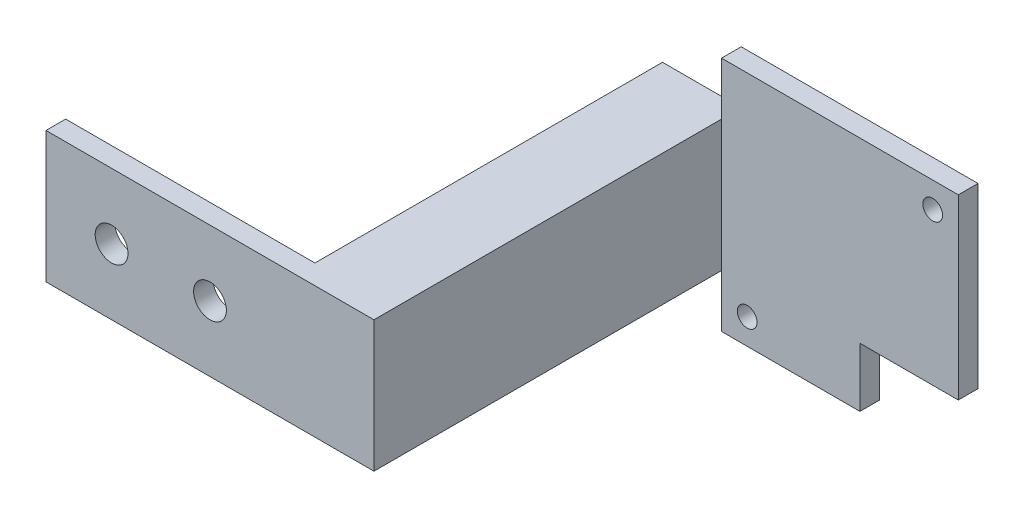
ISO-10303-21;
HEADER;
FILE_DESCRIPTION(('STEP AP214'),'2;1');
FILE_NAME('part.step','',(''),(''),'','','');
FILE_SCHEMA(('AUTOMOTIVE_DESIGN { 1 0 10303 214 1 1 1 1 }'));
ENDSEC;
DATA;
#1=APPLICATION_CONTEXT('core data for automotive mechanical design processes');
#2=APPLICATION_PROTOCOL_DEFINITION('international standard','automotive_design',2000,#1);
#3=PRODUCT_CONTEXT('',#1,'mechanical');
#4=PRODUCT('Part','Part','',(#3));
#5=PRODUCT_RELATED_PRODUCT_CATEGORY('part','',(#4));
#6=PRODUCT_DEFINITION_FORMATION('','',#4);
#7=PRODUCT_DEFINITION_CONTEXT('part definition',#1,'design');
#8=PRODUCT_DEFINITION('design','',#6,#7);
#9=PRODUCT_DEFINITION_SHAPE('','',#8);
#10=(LENGTH_UNIT() NAMED_UNIT(*) SI_UNIT(.MILLI.,.METRE.));
#11=(NAMED_UNIT(*) PLANE_ANGLE_UNIT() SI_UNIT($,.RADIAN.));
#12=(NAMED_UNIT(*) SI_UNIT($,.STERADIAN.) SOLID_ANGLE_UNIT());
#13=UNCERTAINTY_MEASURE_WITH_UNIT(LENGTH_MEASURE(1.E-05),#10,'distance_accuracy_value','');
#14=(GEOMETRIC_REPRESENTATION_CONTEXT(3) GLOBAL_UNCERTAINTY_ASSIGNED_CONTEXT((#13)) GLOBAL_UNIT_ASSIGNED_CONTEXT((#10,
#11,#12)) REPRESENTATION_CONTEXT('',''));
#15=CARTESIAN_POINT('',(0.,0.,0.));
#16=DIRECTION('',(0.,0.,1.));
#17=DIRECTION('',(1.,0.,0.));
#18=AXIS2_PLACEMENT_3D('',#15,#16,#17);
#19=CARTESIAN_POINT('',(-18.05,-18.05,3.));
#20=DIRECTION('',(1.,0.,0.));
#21=DIRECTION('',(0.,0.,-1.));
#22=AXIS2_PLACEMENT_3D('',#19,#20,#21);
#23=PLANE('',#22);
#24=DIRECTION('',(0.,0.,1.));
#25=VECTOR('',#24,1.);
#26=CARTESIAN_POINT('',(-18.05,-10.,0.));
#27=LINE('',#26,#25);
#28=CARTESIAN_POINT('',(-18.05,-10.,0.));
#29=VERTEX_POINT('',#28);
#30=CARTESIAN_POINT('',(-18.05,-10.,3.));
#31=VERTEX_POINT('',#30);
#32=EDGE_CURVE('E221',#29,#31,#27,.T.);
#33=ORIENTED_EDGE('',*,*,#32,.F.);
#34=DIRECTION('',(0.,-1.,0.));
#35=VECTOR('',#34,1.);
#36=CARTESIAN_POINT('',(-18.05,-18.05,0.));
#37=LINE('',#36,#35);
#38=CARTESIAN_POINT('',(-18.05,-18.05,0.));
#39=VERTEX_POINT('',#38);
#40=EDGE_CURVE('E262',#29,#39,#37,.T.);
#41=ORIENTED_EDGE('',*,*,#40,.T.);
#42=DIRECTION('',(0.,0.,-1.));
#43=VECTOR('',#42,1.);
#44=CARTESIAN_POINT('',(-18.05,-18.05,3.));
#45=LINE('',#44,#43);
#46=CARTESIAN_POINT('',(-18.05,-18.05,3.));
#47=VERTEX_POINT('',#46);
#48=EDGE_CURVE('E11',#47,#39,#45,.T.);
#49=ORIENTED_EDGE('',*,*,#48,.F.);
#50=DIRECTION('',(0.,-1.,0.));
#51=VECTOR('',#50,1.);
#52=CARTESIAN_POINT('',(-18.05,-18.05,3.));
#53=LINE('',#52,#51);
#54=EDGE_CURVE('E92',#31,#47,#53,.T.);
#55=ORIENTED_EDGE('',*,*,#54,.F.);
#56=EDGE_LOOP('',(#33,#41,#49,#55));
#57=FACE_BOUND('',#56,.T.);
#58=ADVANCED_FACE('F44',(#57),#23,.F.);
#59=CARTESIAN_POINT('',(-18.05,18.05,0.));
#60=VERTEX_POINT('',#59);
#61=CARTESIAN_POINT('',(-18.05,10.,0.));
#62=VERTEX_POINT('',#61);
#63=EDGE_CURVE('E286',#60,#62,#37,.T.);
#64=ORIENTED_EDGE('',*,*,#63,.T.);
#65=DIRECTION('',(0.,0.,1.));
#66=VECTOR('',#65,1.);
#67=CARTESIAN_POINT('',(-18.05,10.,0.));
#68=LINE('',#67,#66);
#69=CARTESIAN_POINT('',(-18.05,10.,3.));
#70=VERTEX_POINT('',#69);
#71=EDGE_CURVE('E220',#62,#70,#68,.T.);
#72=ORIENTED_EDGE('',*,*,#71,.T.);
#73=CARTESIAN_POINT('',(-18.05,18.05,3.));
#74=VERTEX_POINT('',#73);
#75=EDGE_CURVE('E274',#74,#70,#53,.T.);
#76=ORIENTED_EDGE('',*,*,#75,.F.);
#77=DIRECTION('',(0.,0.,-1.));
#78=VECTOR('',#77,1.);
#79=CARTESIAN_POINT('',(-18.05,18.05,3.));
#80=LINE('',#79,#78);
#81=EDGE_CURVE('E285',#74,#60,#80,.T.);
#82=ORIENTED_EDGE('',*,*,#81,.T.);
#83=EDGE_LOOP('',(#64,#72,#76,#82));
#84=FACE_BOUND('',#83,.T.);
#85=ADVANCED_FACE('F46',(#84),#23,.F.);
#86=CARTESIAN_POINT('',(18.05,-18.05,3.));
#87=DIRECTION('',(0.,1.,0.));
#88=DIRECTION('',(-1.,0.,0.));
#89=AXIS2_PLACEMENT_3D('',#86,#87,#88);
#90=PLANE('',#89);
#91=DIRECTION('',(1.,0.,0.));
#92=VECTOR('',#91,1.);
#93=CARTESIAN_POINT('',(18.05,-18.05,0.));
#94=LINE('',#93,#92);
#95=CARTESIAN_POINT('',(3.05,-18.05,0.));
#96=VERTEX_POINT('',#95);
#97=EDGE_CURVE('E290',#39,#96,#94,.T.);
#98=ORIENTED_EDGE('',*,*,#97,.T.);
#99=DIRECTION('',(0.,0.,1.));
#100=VECTOR('',#99,1.);
#101=CARTESIAN_POINT('',(3.05,-18.05,0.));
#102=LINE('',#101,#100);
#103=CARTESIAN_POINT('',(3.05,-18.05,3.));
#104=VERTEX_POINT('',#103);
#105=EDGE_CURVE('E248',#96,#104,#102,.T.);
#106=ORIENTED_EDGE('',*,*,#105,.T.);
#107=DIRECTION('',(1.,0.,0.));
#108=VECTOR('',#107,1.);
#109=CARTESIAN_POINT('',(18.05,-18.05,3.));
#110=LINE('',#109,#108);
#111=EDGE_CURVE('E277',#47,#104,#110,.T.);
#112=ORIENTED_EDGE('',*,*,#111,.F.);
#113=ORIENTED_EDGE('',*,*,#48,.T.);
#114=EDGE_LOOP('',(#98,#106,#112,#113));
#115=FACE_BOUND('',#114,.T.);
#116=ADVANCED_FACE('F325',(#115),#90,.F.);
#117=CARTESIAN_POINT('',(18.05,-18.05,3.));
#118=DIRECTION('',(-1.,0.,0.));
#119=DIRECTION('',(0.,0.,1.));
#120=AXIS2_PLACEMENT_3D('',#117,#118,#119);
#121=PLANE('',#120);
#122=DIRECTION('',(0.,1.,0.));
#123=VECTOR('',#122,1.);
#124=CARTESIAN_POINT('',(18.05,-18.05,3.));
#125=LINE('',#124,#123);
#126=CARTESIAN_POINT('',(18.05,-9.05,3.));
#127=VERTEX_POINT('',#126);
#128=CARTESIAN_POINT('',(18.05,18.05,3.));
#129=VERTEX_POINT('',#128);
#130=EDGE_CURVE('E280',#127,#129,#125,.T.);
#131=ORIENTED_EDGE('',*,*,#130,.F.);
#132=DIRECTION('',(0.,0.,1.));
#133=VECTOR('',#132,1.);
#134=CARTESIAN_POINT('',(18.05,-9.05,0.));
#135=LINE('',#134,#133);
#136=CARTESIAN_POINT('',(18.05,-9.05,0.));
#137=VERTEX_POINT('',#136);
#138=EDGE_CURVE('E242',#137,#127,#135,.T.);
#139=ORIENTED_EDGE('',*,*,#138,.F.);
#140=DIRECTION('',(0.,1.,0.));
#141=VECTOR('',#140,1.);
#142=CARTESIAN_POINT('',(18.05,-18.05,0.));
#143=LINE('',#142,#141);
#144=CARTESIAN_POINT('',(18.05,18.05,0.));
#145=VERTEX_POINT('',#144);
#146=EDGE_CURVE('E294',#137,#145,#143,.T.);
#147=ORIENTED_EDGE('',*,*,#146,.T.);
#148=DIRECTION('',(0.,0.,-1.));
#149=VECTOR('',#148,1.);
#150=CARTESIAN_POINT('',(18.05,18.05,3.));
#151=LINE('',#150,#149);
#152=EDGE_CURVE('E53',#129,#145,#151,.T.);
#153=ORIENTED_EDGE('',*,*,#152,.F.);
#154=EDGE_LOOP('',(#131,#139,#147,#153));
#155=FACE_BOUND('',#154,.T.);
#156=ADVANCED_FACE('F332',(#155),#121,.F.);
#157=CARTESIAN_POINT('',(18.05,18.05,3.));
#158=DIRECTION('',(0.,-1.,0.));
#159=DIRECTION('',(1.,0.,0.));
#160=AXIS2_PLACEMENT_3D('',#157,#158,#159);
#161=PLANE('',#160);
#162=DIRECTION('',(-1.,0.,0.));
#163=VECTOR('',#162,1.);
#164=CARTESIAN_POINT('',(18.05,18.05,0.));
#165=LINE('',#164,#163);
#166=EDGE_CURVE('E86',#145,#60,#165,.T.);
#167=ORIENTED_EDGE('',*,*,#166,.T.);
#168=ORIENTED_EDGE('',*,*,#81,.F.);
#169=DIRECTION('',(-1.,0.,0.));
#170=VECTOR('',#169,1.);
#171=CARTESIAN_POINT('',(18.05,18.05,3.));
#172=LINE('',#171,#170);
#173=EDGE_CURVE('E69',#129,#74,#172,.T.);
#174=ORIENTED_EDGE('',*,*,#173,.F.);
#175=ORIENTED_EDGE('',*,*,#152,.T.);
#176=EDGE_LOOP('',(#167,#168,#174,#175));
#177=FACE_BOUND('',#176,.T.);
#178=ADVANCED_FACE('F302',(#177),#161,.F.);
#179=CARTESIAN_POINT('',(0.,0.,3.));
#180=DIRECTION('',(0.,0.,1.));
#181=DIRECTION('',(1.,0.,0.));
#182=AXIS2_PLACEMENT_3D('',#179,#180,#181);
#183=PLANE('',#182);
#184=DIRECTION('',(0.,1.,0.));
#185=VECTOR('',#184,1.);
#186=CARTESIAN_POINT('',(-18.05,-10.,3.));
#187=LINE('',#186,#185);
#188=EDGE_CURVE('E156',#31,#70,#187,.T.);
#189=ORIENTED_EDGE('',*,*,#188,.F.);
#190=ORIENTED_EDGE('',*,*,#54,.T.);
#191=ORIENTED_EDGE('',*,*,#111,.T.);
#192=DIRECTION('',(0.,-1.,0.));
#193=VECTOR('',#192,1.);
#194=CARTESIAN_POINT('',(3.05,-18.05,3.));
#195=LINE('',#194,#193);
#196=CARTESIAN_POINT('',(3.05,-9.05,3.));
#197=VERTEX_POINT('',#196);
#198=EDGE_CURVE('E239',#197,#104,#195,.T.);
#199=ORIENTED_EDGE('',*,*,#198,.F.);
#200=DIRECTION('',(-1.,0.,0.));
#201=VECTOR('',#200,1.);
#202=CARTESIAN_POINT('',(18.05,-9.05,3.));
#203=LINE('',#202,#201);
#204=EDGE_CURVE('E225',#127,#197,#203,.T.);
#205=ORIENTED_EDGE('',*,*,#204,.F.);
#206=ORIENTED_EDGE('',*,*,#130,.T.);
#207=ORIENTED_EDGE('',*,*,#173,.T.);
#208=ORIENTED_EDGE('',*,*,#75,.T.);
#209=EDGE_LOOP('',(#189,#190,#191,#199,#205,#206,#207,#208));
#210=FACE_BOUND('',#209,.T.);
#211=CARTESIAN_POINT('',(14.1421356237309,14.1421356237309,3.));
#212=DIRECTION('',(0.,0.,1.));
#213=DIRECTION('',(1.,0.,0.));
#214=AXIS2_PLACEMENT_3D('',#211,#212,#213);
#215=CIRCLE('',#214,1.5);
#216=CARTESIAN_POINT('',(15.642135623731,14.1421356237309,3.));
#217=VERTEX_POINT('',#216);
#218=EDGE_CURVE('E263',#217,#217,#215,.T.);
#219=ORIENTED_EDGE('',*,*,#218,.F.);
#220=EDGE_LOOP('',(#219));
#221=FACE_BOUND('',#220,.T.);
#222=CARTESIAN_POINT('',(-14.1421356237309,-14.142135623731,3.));
#223=DIRECTION('',(0.,0.,1.));
#224=DIRECTION('',(-1.,0.,0.));
#225=AXIS2_PLACEMENT_3D('',#222,#223,#224);
#226=CIRCLE('',#225,1.5);
#227=CARTESIAN_POINT('',(-15.6421356237309,-14.142135623731,3.));
#228=VERTEX_POINT('',#227);
#229=EDGE_CURVE('E267',#228,#228,#226,.T.);
#230=ORIENTED_EDGE('',*,*,#229,.F.);
#231=EDGE_LOOP('',(#230));
#232=FACE_BOUND('',#231,.T.);
#233=ADVANCED_FACE('F312',(#210,#221,#232),#183,.T.);
#234=CARTESIAN_POINT('',(0.,0.,0.));
#235=DIRECTION('',(0.,0.,1.));
#236=DIRECTION('',(1.,0.,0.));
#237=AXIS2_PLACEMENT_3D('',#234,#235,#236);
#238=PLANE('',#237);
#239=CARTESIAN_POINT('',(14.1421356237309,14.1421356237309,0.));
#240=DIRECTION('',(0.,0.,1.));
#241=DIRECTION('',(1.,0.,0.));
#242=AXIS2_PLACEMENT_3D('',#239,#240,#241);
#243=CIRCLE('',#242,1.5);
#244=CARTESIAN_POINT('',(15.642135623731,14.1421356237309,0.));
#245=VERTEX_POINT('',#244);
#246=EDGE_CURVE('E258',#245,#245,#243,.T.);
#247=ORIENTED_EDGE('',*,*,#246,.T.);
#248=EDGE_LOOP('',(#247));
#249=FACE_BOUND('',#248,.T.);
#250=CARTESIAN_POINT('',(-14.1421356237309,-14.142135623731,0.));
#251=DIRECTION('',(0.,0.,1.));
#252=DIRECTION('',(-1.,0.,0.));
#253=AXIS2_PLACEMENT_3D('',#250,#251,#252);
#254=CIRCLE('',#253,1.5);
#255=CARTESIAN_POINT('',(-15.6421356237309,-14.142135623731,0.));
#256=VERTEX_POINT('',#255);
#257=EDGE_CURVE('E252',#256,#256,#254,.T.);
#258=ORIENTED_EDGE('',*,*,#257,.T.);
#259=EDGE_LOOP('',(#258));
#260=FACE_BOUND('',#259,.T.);
#261=DIRECTION('',(-1.,0.,0.));
#262=VECTOR('',#261,1.);
#263=CARTESIAN_POINT('',(18.05,-9.05,0.));
#264=LINE('',#263,#262);
#265=CARTESIAN_POINT('',(3.05,-9.05,0.));
#266=VERTEX_POINT('',#265);
#267=EDGE_CURVE('E235',#137,#266,#264,.T.);
#268=ORIENTED_EDGE('',*,*,#267,.T.);
#269=DIRECTION('',(0.,-1.,0.));
#270=VECTOR('',#269,1.);
#271=CARTESIAN_POINT('',(3.05,-18.05,0.));
#272=LINE('',#271,#270);
#273=EDGE_CURVE('E60',#266,#96,#272,.T.);
#274=ORIENTED_EDGE('',*,*,#273,.T.);
#275=ORIENTED_EDGE('',*,*,#97,.F.);
#276=ORIENTED_EDGE('',*,*,#40,.F.);
#277=DIRECTION('',(-1.,0.,0.));
#278=VECTOR('',#277,1.);
#279=CARTESIAN_POINT('',(0.,-10.,0.));
#280=LINE('',#279,#278);
#281=CARTESIAN_POINT('',(-30.05,-10.,0.));
#282=VERTEX_POINT('',#281);
#283=EDGE_CURVE('E217',#29,#282,#280,.T.);
#284=ORIENTED_EDGE('',*,*,#283,.T.);
#285=DIRECTION('',(0.,1.,0.));
#286=VECTOR('',#285,1.);
#287=CARTESIAN_POINT('',(-30.05,0.,0.));
#288=LINE('',#287,#286);
#289=CARTESIAN_POINT('',(-30.05,10.,0.));
#290=VERTEX_POINT('',#289);
#291=EDGE_CURVE('E214',#282,#290,#288,.T.);
#292=ORIENTED_EDGE('',*,*,#291,.T.);
#293=DIRECTION('',(-1.,0.,0.));
#294=VECTOR('',#293,1.);
#295=CARTESIAN_POINT('',(0.,10.,0.));
#296=LINE('',#295,#294);
#297=EDGE_CURVE('E159',#62,#290,#296,.T.);
#298=ORIENTED_EDGE('',*,*,#297,.F.);
#299=ORIENTED_EDGE('',*,*,#63,.F.);
#300=ORIENTED_EDGE('',*,*,#166,.F.);
#301=ORIENTED_EDGE('',*,*,#146,.F.);
#302=EDGE_LOOP('',(#268,#274,#275,#276,#284,#292,#298,#299,#300,#301));
#303=FACE_BOUND('',#302,.T.);
#304=ADVANCED_FACE('F308',(#249,#260,#303),#238,.F.);
#305=CARTESIAN_POINT('',(-14.1421356237309,-14.142135623731,0.));
#306=DIRECTION('',(0.,0.,1.));
#307=DIRECTION('',(1.,0.,0.));
#308=AXIS2_PLACEMENT_3D('',#305,#306,#307);
#309=CYLINDRICAL_SURFACE('',#308,1.5);
#310=ORIENTED_EDGE('',*,*,#257,.F.);
#311=EDGE_LOOP('',(#310));
#312=FACE_BOUND('',#311,.T.);
#313=ORIENTED_EDGE('',*,*,#229,.T.);
#314=EDGE_LOOP('',(#313));
#315=FACE_BOUND('',#314,.T.);
#316=ADVANCED_FACE('F518',(#312,#315),#309,.F.);
#317=CARTESIAN_POINT('',(14.1421356237309,14.1421356237309,0.));
#318=DIRECTION('',(0.,0.,1.));
#319=DIRECTION('',(1.,0.,0.));
#320=AXIS2_PLACEMENT_3D('',#317,#318,#319);
#321=CYLINDRICAL_SURFACE('',#320,1.5);
#322=ORIENTED_EDGE('',*,*,#246,.F.);
#323=EDGE_LOOP('',(#322));
#324=FACE_BOUND('',#323,.T.);
#325=ORIENTED_EDGE('',*,*,#218,.T.);
#326=EDGE_LOOP('',(#325));
#327=FACE_BOUND('',#326,.T.);
#328=ADVANCED_FACE('F359',(#324,#327),#321,.F.);
#329=CARTESIAN_POINT('',(3.05,-18.05,0.));
#330=DIRECTION('',(-1.,0.,0.));
#331=DIRECTION('',(0.,0.,1.));
#332=AXIS2_PLACEMENT_3D('',#329,#330,#331);
#333=PLANE('',#332);
#334=ORIENTED_EDGE('',*,*,#198,.T.);
#335=ORIENTED_EDGE('',*,*,#105,.F.);
#336=ORIENTED_EDGE('',*,*,#273,.F.);
#337=DIRECTION('',(0.,0.,1.));
#338=VECTOR('',#337,1.);
#339=CARTESIAN_POINT('',(3.05,-9.05,0.));
#340=LINE('',#339,#338);
#341=EDGE_CURVE('E253',#266,#197,#340,.T.);
#342=ORIENTED_EDGE('',*,*,#341,.T.);
#343=EDGE_LOOP('',(#334,#335,#336,#342));
#344=FACE_BOUND('',#343,.T.);
#345=ADVANCED_FACE('F328',(#344),#333,.F.);
#346=CARTESIAN_POINT('',(18.05,-9.05,0.));
#347=DIRECTION('',(0.,1.,0.));
#348=DIRECTION('',(-1.,0.,0.));
#349=AXIS2_PLACEMENT_3D('',#346,#347,#348);
#350=PLANE('',#349);
#351=ORIENTED_EDGE('',*,*,#204,.T.);
#352=ORIENTED_EDGE('',*,*,#341,.F.);
#353=ORIENTED_EDGE('',*,*,#267,.F.);
#354=ORIENTED_EDGE('',*,*,#138,.T.);
#355=EDGE_LOOP('',(#351,#352,#353,#354));
#356=FACE_BOUND('',#355,.T.);
#357=ADVANCED_FACE('F330',(#356),#350,.F.);
#358=CARTESIAN_POINT('',(0.,-10.,0.));
#359=DIRECTION('',(0.,1.,0.));
#360=DIRECTION('',(-1.,0.,0.));
#361=AXIS2_PLACEMENT_3D('',#358,#359,#360);
#362=PLANE('',#361);
#363=ORIENTED_EDGE('',*,*,#32,.T.);
#364=DIRECTION('',(0.,0.,-1.));
#365=VECTOR('',#364,1.);
#366=CARTESIAN_POINT('',(-18.05,-10.,53.));
#367=LINE('',#366,#365);
#368=CARTESIAN_POINT('',(-18.05,-10.,56.));
#369=VERTEX_POINT('',#368);
#370=EDGE_CURVE('E160',#369,#31,#367,.T.);
#371=ORIENTED_EDGE('',*,*,#370,.F.);
#372=DIRECTION('',(1.,0.,0.));
#373=VECTOR('',#372,1.);
#374=CARTESIAN_POINT('',(-18.05,-10.,56.));
#375=LINE('',#374,#373);
#376=CARTESIAN_POINT('',(-68.05,-10.,56.));
#377=VERTEX_POINT('',#376);
#378=EDGE_CURVE('E175',#377,#369,#375,.T.);
#379=ORIENTED_EDGE('',*,*,#378,.F.);
#380=DIRECTION('',(0.,0.,-1.));
#381=VECTOR('',#380,1.);
#382=CARTESIAN_POINT('',(-68.05,-10.,56.));
#383=LINE('',#382,#381);
#384=CARTESIAN_POINT('',(-68.05,-10.,53.));
#385=VERTEX_POINT('',#384);
#386=EDGE_CURVE('E191',#377,#385,#383,.T.);
#387=ORIENTED_EDGE('',*,*,#386,.T.);
#388=DIRECTION('',(1.,0.,0.));
#389=VECTOR('',#388,1.);
#390=CARTESIAN_POINT('',(-18.05,-10.,53.));
#391=LINE('',#390,#389);
#392=CARTESIAN_POINT('',(-30.05,-10.,53.));
#393=VERTEX_POINT('',#392);
#394=EDGE_CURVE('E177',#385,#393,#391,.T.);
#395=ORIENTED_EDGE('',*,*,#394,.T.);
#396=DIRECTION('',(0.,0.,1.));
#397=VECTOR('',#396,1.);
#398=CARTESIAN_POINT('',(-30.05,-10.,0.));
#399=LINE('',#398,#397);
#400=EDGE_CURVE('E226',#282,#393,#399,.T.);
#401=ORIENTED_EDGE('',*,*,#400,.F.);
#402=ORIENTED_EDGE('',*,*,#283,.F.);
#403=EDGE_LOOP('',(#363,#371,#379,#387,#395,#401,#402));
#404=FACE_BOUND('',#403,.T.);
#405=ADVANCED_FACE('F316',(#404),#362,.F.);
#406=CARTESIAN_POINT('',(-30.05,0.,0.));
#407=DIRECTION('',(1.,0.,0.));
#408=DIRECTION('',(0.,0.,-1.));
#409=AXIS2_PLACEMENT_3D('',#406,#407,#408);
#410=PLANE('',#409);
#411=ORIENTED_EDGE('',*,*,#400,.T.);
#412=DIRECTION('',(0.,-1.,0.));
#413=VECTOR('',#412,1.);
#414=CARTESIAN_POINT('',(-30.05,-10.,53.));
#415=LINE('',#414,#413);
#416=CARTESIAN_POINT('',(-30.05,10.,53.));
#417=VERTEX_POINT('',#416);
#418=EDGE_CURVE('E203',#417,#393,#415,.T.);
#419=ORIENTED_EDGE('',*,*,#418,.F.);
#420=DIRECTION('',(0.,0.,1.));
#421=VECTOR('',#420,1.);
#422=CARTESIAN_POINT('',(-30.05,10.,0.));
#423=LINE('',#422,#421);
#424=EDGE_CURVE('E229',#290,#417,#423,.T.);
#425=ORIENTED_EDGE('',*,*,#424,.F.);
#426=ORIENTED_EDGE('',*,*,#291,.F.);
#427=EDGE_LOOP('',(#411,#419,#425,#426));
#428=FACE_BOUND('',#427,.T.);
#429=ADVANCED_FACE('F391',(#428),#410,.F.);
#430=CARTESIAN_POINT('',(0.,10.,0.));
#431=DIRECTION('',(0.,1.,0.));
#432=DIRECTION('',(-1.,0.,0.));
#433=AXIS2_PLACEMENT_3D('',#430,#431,#432);
#434=PLANE('',#433);
#435=ORIENTED_EDGE('',*,*,#424,.T.);
#436=DIRECTION('',(-1.,0.,0.));
#437=VECTOR('',#436,1.);
#438=CARTESIAN_POINT('',(-18.05,10.,53.));
#439=LINE('',#438,#437);
#440=CARTESIAN_POINT('',(-68.05,10.,53.));
#441=VERTEX_POINT('',#440);
#442=EDGE_CURVE('E192',#417,#441,#439,.T.);
#443=ORIENTED_EDGE('',*,*,#442,.T.);
#444=DIRECTION('',(0.,0.,-1.));
#445=VECTOR('',#444,1.);
#446=CARTESIAN_POINT('',(-68.05,10.,56.));
#447=LINE('',#446,#445);
#448=CARTESIAN_POINT('',(-68.05,10.,56.));
#449=VERTEX_POINT('',#448);
#450=EDGE_CURVE('E166',#449,#441,#447,.T.);
#451=ORIENTED_EDGE('',*,*,#450,.F.);
#452=DIRECTION('',(-1.,0.,0.));
#453=VECTOR('',#452,1.);
#454=CARTESIAN_POINT('',(-18.05,10.,56.));
#455=LINE('',#454,#453);
#456=CARTESIAN_POINT('',(-18.05,10.,56.));
#457=VERTEX_POINT('',#456);
#458=EDGE_CURVE('E163',#457,#449,#455,.T.);
#459=ORIENTED_EDGE('',*,*,#458,.F.);
#460=DIRECTION('',(0.,0.,-1.));
#461=VECTOR('',#460,1.);
#462=CARTESIAN_POINT('',(-18.05,10.,53.));
#463=LINE('',#462,#461);
#464=EDGE_CURVE('E150',#457,#70,#463,.T.);
#465=ORIENTED_EDGE('',*,*,#464,.T.);
#466=ORIENTED_EDGE('',*,*,#71,.F.);
#467=ORIENTED_EDGE('',*,*,#297,.T.);
#468=EDGE_LOOP('',(#435,#443,#451,#459,#465,#466,#467));
#469=FACE_BOUND('',#468,.T.);
#470=ADVANCED_FACE('F164',(#469),#434,.T.);
#471=CARTESIAN_POINT('',(-18.05,-10.,53.));
#472=DIRECTION('',(-1.,0.,0.));
#473=DIRECTION('',(0.,0.,1.));
#474=AXIS2_PLACEMENT_3D('',#471,#472,#473);
#475=PLANE('',#474);
#476=ORIENTED_EDGE('',*,*,#188,.T.);
#477=ORIENTED_EDGE('',*,*,#464,.F.);
#478=DIRECTION('',(0.,1.,0.));
#479=VECTOR('',#478,1.);
#480=CARTESIAN_POINT('',(-18.05,-10.,56.));
#481=LINE('',#480,#479);
#482=EDGE_CURVE('E155',#369,#457,#481,.T.);
#483=ORIENTED_EDGE('',*,*,#482,.F.);
#484=ORIENTED_EDGE('',*,*,#370,.T.);
#485=EDGE_LOOP('',(#476,#477,#483,#484));
#486=FACE_BOUND('',#485,.T.);
#487=ADVANCED_FACE('F152',(#486),#475,.F.);
#488=CARTESIAN_POINT('',(0.,0.,53.));
#489=DIRECTION('',(0.,0.,1.));
#490=DIRECTION('',(1.,0.,0.));
#491=AXIS2_PLACEMENT_3D('',#488,#489,#490);
#492=PLANE('',#491);
#493=CARTESIAN_POINT('',(-58.05,0.,53.));
#494=DIRECTION('',(0.,0.,1.));
#495=DIRECTION('',(1.,0.,0.));
#496=AXIS2_PLACEMENT_3D('',#493,#494,#495);
#497=CIRCLE('',#496,2.5);
#498=CARTESIAN_POINT('',(-55.55,0.,53.));
#499=VERTEX_POINT('',#498);
#500=EDGE_CURVE('E195',#499,#499,#497,.T.);
#501=ORIENTED_EDGE('',*,*,#500,.T.);
#502=EDGE_LOOP('',(#501));
#503=FACE_BOUND('',#502,.T.);
#504=CARTESIAN_POINT('',(-43.05,0.,53.));
#505=DIRECTION('',(0.,0.,1.));
#506=DIRECTION('',(1.,0.,0.));
#507=AXIS2_PLACEMENT_3D('',#504,#505,#506);
#508=CIRCLE('',#507,2.5);
#509=CARTESIAN_POINT('',(-40.55,0.,53.));
#510=VERTEX_POINT('',#509);
#511=EDGE_CURVE('E184',#510,#510,#508,.T.);
#512=ORIENTED_EDGE('',*,*,#511,.T.);
#513=EDGE_LOOP('',(#512));
#514=FACE_BOUND('',#513,.T.);
#515=ORIENTED_EDGE('',*,*,#442,.F.);
#516=ORIENTED_EDGE('',*,*,#418,.T.);
#517=ORIENTED_EDGE('',*,*,#394,.F.);
#518=DIRECTION('',(0.,-1.,0.));
#519=VECTOR('',#518,1.);
#520=CARTESIAN_POINT('',(-68.05,-10.,53.));
#521=LINE('',#520,#519);
#522=EDGE_CURVE('E181',#441,#385,#521,.T.);
#523=ORIENTED_EDGE('',*,*,#522,.F.);
#524=EDGE_LOOP('',(#515,#516,#517,#523));
#525=FACE_BOUND('',#524,.T.);
#526=ADVANCED_FACE('F412',(#503,#514,#525),#492,.F.);
#527=CARTESIAN_POINT('',(-68.05,-10.,56.));
#528=DIRECTION('',(1.,0.,0.));
#529=DIRECTION('',(0.,0.,-1.));
#530=AXIS2_PLACEMENT_3D('',#527,#528,#529);
#531=PLANE('',#530);
#532=ORIENTED_EDGE('',*,*,#522,.T.);
#533=ORIENTED_EDGE('',*,*,#386,.F.);
#534=DIRECTION('',(0.,-1.,0.));
#535=VECTOR('',#534,1.);
#536=CARTESIAN_POINT('',(-68.05,-10.,56.));
#537=LINE('',#536,#535);
#538=EDGE_CURVE('E170',#449,#377,#537,.T.);
#539=ORIENTED_EDGE('',*,*,#538,.F.);
#540=ORIENTED_EDGE('',*,*,#450,.T.);
#541=EDGE_LOOP('',(#532,#533,#539,#540));
#542=FACE_BOUND('',#541,.T.);
#543=ADVANCED_FACE('F420',(#542),#531,.F.);
#544=CARTESIAN_POINT('',(0.,0.,56.));
#545=DIRECTION('',(0.,0.,1.));
#546=DIRECTION('',(1.,0.,0.));
#547=AXIS2_PLACEMENT_3D('',#544,#545,#546);
#548=PLANE('',#547);
#549=CARTESIAN_POINT('',(-58.05,0.,56.));
#550=DIRECTION('',(0.,0.,1.));
#551=DIRECTION('',(1.,0.,0.));
#552=AXIS2_PLACEMENT_3D('',#549,#550,#551);
#553=CIRCLE('',#552,2.5);
#554=CARTESIAN_POINT('',(-55.55,0.,56.));
#555=VERTEX_POINT('',#554);
#556=EDGE_CURVE('E589',#555,#555,#553,.T.);
#557=ORIENTED_EDGE('',*,*,#556,.F.);
#558=EDGE_LOOP('',(#557));
#559=FACE_BOUND('',#558,.T.);
#560=CARTESIAN_POINT('',(-43.05,0.,56.));
#561=DIRECTION('',(0.,0.,1.));
#562=DIRECTION('',(1.,0.,0.));
#563=AXIS2_PLACEMENT_3D('',#560,#561,#562);
#564=CIRCLE('',#563,2.5);
#565=CARTESIAN_POINT('',(-40.55,0.,56.));
#566=VERTEX_POINT('',#565);
#567=EDGE_CURVE('E591',#566,#566,#564,.T.);
#568=ORIENTED_EDGE('',*,*,#567,.F.);
#569=EDGE_LOOP('',(#568));
#570=FACE_BOUND('',#569,.T.);
#571=ORIENTED_EDGE('',*,*,#482,.T.);
#572=ORIENTED_EDGE('',*,*,#458,.T.);
#573=ORIENTED_EDGE('',*,*,#538,.T.);
#574=ORIENTED_EDGE('',*,*,#378,.T.);
#575=EDGE_LOOP('',(#571,#572,#573,#574));
#576=FACE_BOUND('',#575,.T.);
#577=ADVANCED_FACE('F173',(#559,#570,#576),#548,.T.);
#578=CARTESIAN_POINT('',(-43.05,0.,53.));
#579=DIRECTION('',(0.,0.,1.));
#580=DIRECTION('',(1.,0.,0.));
#581=AXIS2_PLACEMENT_3D('',#578,#579,#580);
#582=CYLINDRICAL_SURFACE('',#581,2.5);
#583=ORIENTED_EDGE('',*,*,#511,.F.);
#584=EDGE_LOOP('',(#583));
#585=FACE_BOUND('',#584,.T.);
#586=ORIENTED_EDGE('',*,*,#567,.T.);
#587=EDGE_LOOP('',(#586));
#588=FACE_BOUND('',#587,.T.);
#589=ADVANCED_FACE('F434',(#585,#588),#582,.F.);
#590=CARTESIAN_POINT('',(-58.05,0.,53.));
#591=DIRECTION('',(0.,0.,1.));
#592=DIRECTION('',(1.,0.,0.));
#593=AXIS2_PLACEMENT_3D('',#590,#591,#592);
#594=CYLINDRICAL_SURFACE('',#593,2.5);
#595=ORIENTED_EDGE('',*,*,#500,.F.);
#596=EDGE_LOOP('',(#595));
#597=FACE_BOUND('',#596,.T.);
#598=ORIENTED_EDGE('',*,*,#556,.T.);
#599=EDGE_LOOP('',(#598));
#600=FACE_BOUND('',#599,.T.);
#601=ADVANCED_FACE('F442',(#597,#600),#594,.F.);
#602=CLOSED_SHELL('',(#58,#85,#116,#156,#178,#233,#304,#316,#328,#345,#357,#405,#429,#470,#487,
#526,#543,#577,#589,#601));
#603=MANIFOLD_SOLID_BREP('B2',#602);
#604=ADVANCED_BREP_SHAPE_REPRESENTATION('',(#18,#603),#14);
#605=SHAPE_DEFINITION_REPRESENTATION(#9,#604);
ENDSEC;
END-ISO-10303-21;
